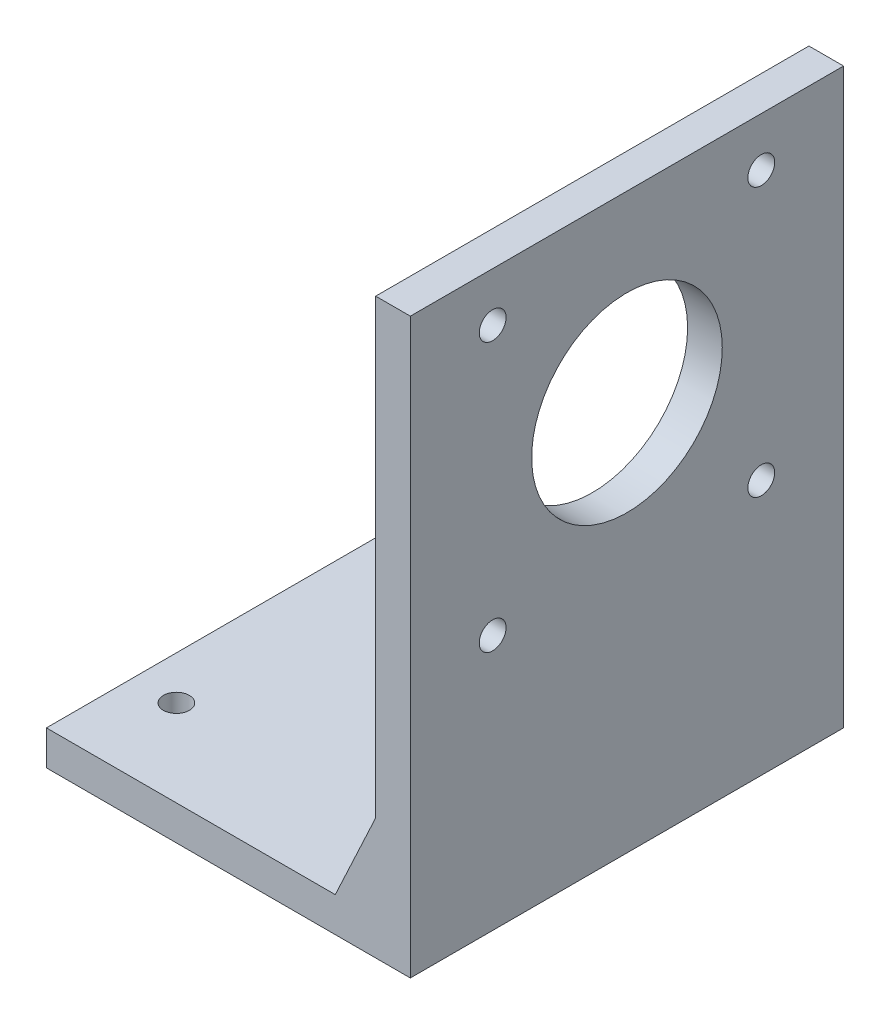
ISO-10303-21;
HEADER;
FILE_DESCRIPTION(('STEP AP214'),'2;1');
FILE_NAME('part.step','',(''),(''),'','','');
FILE_SCHEMA(('AUTOMOTIVE_DESIGN { 1 0 10303 214 1 1 1 1 }'));
ENDSEC;
DATA;
#1=APPLICATION_CONTEXT('core data for automotive mechanical design processes');
#2=APPLICATION_PROTOCOL_DEFINITION('international standard','automotive_design',2000,#1);
#3=PRODUCT_CONTEXT('',#1,'mechanical');
#4=PRODUCT('Part','Part','',(#3));
#5=PRODUCT_RELATED_PRODUCT_CATEGORY('part','',(#4));
#6=PRODUCT_DEFINITION_FORMATION('','',#4);
#7=PRODUCT_DEFINITION_CONTEXT('part definition',#1,'design');
#8=PRODUCT_DEFINITION('design','',#6,#7);
#9=PRODUCT_DEFINITION_SHAPE('','',#8);
#10=(LENGTH_UNIT() NAMED_UNIT(*) SI_UNIT(.MILLI.,.METRE.));
#11=(NAMED_UNIT(*) PLANE_ANGLE_UNIT() SI_UNIT($,.RADIAN.));
#12=(NAMED_UNIT(*) SI_UNIT($,.STERADIAN.) SOLID_ANGLE_UNIT());
#13=UNCERTAINTY_MEASURE_WITH_UNIT(LENGTH_MEASURE(1.E-05),#10,'distance_accuracy_value','');
#14=(GEOMETRIC_REPRESENTATION_CONTEXT(3) GLOBAL_UNCERTAINTY_ASSIGNED_CONTEXT((#13)) GLOBAL_UNIT_ASSIGNED_CONTEXT((#10,
#11,#12)) REPRESENTATION_CONTEXT('',''));
#15=CARTESIAN_POINT('',(0.,0.,0.));
#16=DIRECTION('',(0.,0.,1.));
#17=DIRECTION('',(1.,0.,0.));
#18=AXIS2_PLACEMENT_3D('',#15,#16,#17);
#19=CARTESIAN_POINT('',(0.,0.,0.));
#20=DIRECTION('',(1.,0.,0.));
#21=DIRECTION('',(0.,0.,-1.));
#22=AXIS2_PLACEMENT_3D('',#19,#20,#21);
#23=PLANE('',#22);
#24=CARTESIAN_POINT('',(0.,-3.57499999999999,15.5));
#25=DIRECTION('',(1.,0.,0.));
#26=DIRECTION('',(0.,0.,-1.));
#27=AXIS2_PLACEMENT_3D('',#24,#25,#26);
#28=CIRCLE('',#27,1.55);
#29=CARTESIAN_POINT('',(0.,-3.57499999999999,13.95));
#30=VERTEX_POINT('',#29);
#31=EDGE_CURVE('E133',#30,#30,#28,.T.);
#32=ORIENTED_EDGE('',*,*,#31,.T.);
#33=EDGE_LOOP('',(#32));
#34=FACE_BOUND('',#33,.T.);
#35=CARTESIAN_POINT('',(0.,-3.57499999999999,-15.5));
#36=DIRECTION('',(1.,0.,0.));
#37=DIRECTION('',(0.,0.,-1.));
#38=AXIS2_PLACEMENT_3D('',#35,#36,#37);
#39=CIRCLE('',#38,1.55);
#40=CARTESIAN_POINT('',(0.,-3.57499999999999,-17.05));
#41=VERTEX_POINT('',#40);
#42=EDGE_CURVE('E137',#41,#41,#39,.T.);
#43=ORIENTED_EDGE('',*,*,#42,.T.);
#44=EDGE_LOOP('',(#43));
#45=FACE_BOUND('',#44,.T.);
#46=CARTESIAN_POINT('',(0.,27.425,-15.5));
#47=DIRECTION('',(1.,0.,0.));
#48=DIRECTION('',(0.,0.,-1.));
#49=AXIS2_PLACEMENT_3D('',#46,#47,#48);
#50=CIRCLE('',#49,1.55);
#51=CARTESIAN_POINT('',(0.,27.425,-17.05));
#52=VERTEX_POINT('',#51);
#53=EDGE_CURVE('E143',#52,#52,#50,.T.);
#54=ORIENTED_EDGE('',*,*,#53,.T.);
#55=EDGE_LOOP('',(#54));
#56=FACE_BOUND('',#55,.T.);
#57=CARTESIAN_POINT('',(0.,27.425,15.5));
#58=DIRECTION('',(1.,0.,0.));
#59=DIRECTION('',(0.,0.,-1.));
#60=AXIS2_PLACEMENT_3D('',#57,#58,#59);
#61=CIRCLE('',#60,1.55);
#62=CARTESIAN_POINT('',(0.,27.425,13.95));
#63=VERTEX_POINT('',#62);
#64=EDGE_CURVE('E149',#63,#63,#61,.T.);
#65=ORIENTED_EDGE('',*,*,#64,.T.);
#66=EDGE_LOOP('',(#65));
#67=FACE_BOUND('',#66,.T.);
#68=CARTESIAN_POINT('',(0.,11.925,0.));
#69=DIRECTION('',(1.,0.,0.));
#70=DIRECTION('',(0.,0.,-1.));
#71=AXIS2_PLACEMENT_3D('',#68,#69,#70);
#72=CIRCLE('',#71,11.);
#73=CARTESIAN_POINT('',(0.,11.925,-11.));
#74=VERTEX_POINT('',#73);
#75=EDGE_CURVE('E155',#74,#74,#72,.T.);
#76=ORIENTED_EDGE('',*,*,#75,.T.);
#77=EDGE_LOOP('',(#76));
#78=FACE_BOUND('',#77,.T.);
#79=DIRECTION('',(0.,1.,0.));
#80=VECTOR('',#79,1.);
#81=CARTESIAN_POINT('',(0.,33.075,-25.));
#82=LINE('',#81,#80);
#83=CARTESIAN_POINT('',(0.,-19.0750000000001,-25.));
#84=VERTEX_POINT('',#83);
#85=CARTESIAN_POINT('',(0.,33.075,-25.));
#86=VERTEX_POINT('',#85);
#87=EDGE_CURVE('E161',#84,#86,#82,.T.);
#88=ORIENTED_EDGE('',*,*,#87,.F.);
#89=DIRECTION('',(0.,0.,1.));
#90=VECTOR('',#89,1.);
#91=CARTESIAN_POINT('',(0.,-19.0750000000001,25.));
#92=LINE('',#91,#90);
#93=CARTESIAN_POINT('',(0.,-19.0750000000001,25.));
#94=VERTEX_POINT('',#93);
#95=EDGE_CURVE('E57',#84,#94,#92,.T.);
#96=ORIENTED_EDGE('',*,*,#95,.T.);
#97=DIRECTION('',(0.,-1.,0.));
#98=VECTOR('',#97,1.);
#99=CARTESIAN_POINT('',(0.,33.075,25.));
#100=LINE('',#99,#98);
#101=CARTESIAN_POINT('',(0.,33.075,25.));
#102=VERTEX_POINT('',#101);
#103=EDGE_CURVE('E166',#102,#94,#100,.T.);
#104=ORIENTED_EDGE('',*,*,#103,.F.);
#105=DIRECTION('',(0.,0.,1.));
#106=VECTOR('',#105,1.);
#107=CARTESIAN_POINT('',(0.,33.075,25.));
#108=LINE('',#107,#106);
#109=EDGE_CURVE('E172',#86,#102,#108,.T.);
#110=ORIENTED_EDGE('',*,*,#109,.F.);
#111=EDGE_LOOP('',(#88,#96,#104,#110));
#112=FACE_BOUND('',#111,.T.);
#113=ADVANCED_FACE('F36',(#34,#45,#56,#67,#78,#112),#23,.F.);
#114=CARTESIAN_POINT('',(4.,0.,0.));
#115=DIRECTION('',(1.,0.,0.));
#116=DIRECTION('',(0.,0.,-1.));
#117=AXIS2_PLACEMENT_3D('',#114,#115,#116);
#118=PLANE('',#117);
#119=CARTESIAN_POINT('',(4.,-3.57499999999999,-15.5));
#120=DIRECTION('',(1.,0.,0.));
#121=DIRECTION('',(0.,0.,-1.));
#122=AXIS2_PLACEMENT_3D('',#119,#120,#121);
#123=CIRCLE('',#122,1.55);
#124=CARTESIAN_POINT('',(4.,-3.57499999999999,-17.05));
#125=VERTEX_POINT('',#124);
#126=EDGE_CURVE('E140',#125,#125,#123,.T.);
#127=ORIENTED_EDGE('',*,*,#126,.F.);
#128=EDGE_LOOP('',(#127));
#129=FACE_BOUND('',#128,.T.);
#130=CARTESIAN_POINT('',(4.,27.425,15.5));
#131=DIRECTION('',(1.,0.,0.));
#132=DIRECTION('',(0.,0.,-1.));
#133=AXIS2_PLACEMENT_3D('',#130,#131,#132);
#134=CIRCLE('',#133,1.55);
#135=CARTESIAN_POINT('',(4.,27.425,13.95));
#136=VERTEX_POINT('',#135);
#137=EDGE_CURVE('E152',#136,#136,#134,.T.);
#138=ORIENTED_EDGE('',*,*,#137,.F.);
#139=EDGE_LOOP('',(#138));
#140=FACE_BOUND('',#139,.T.);
#141=DIRECTION('',(0.,1.,0.));
#142=VECTOR('',#141,1.);
#143=CARTESIAN_POINT('',(4.,33.075,-25.));
#144=LINE('',#143,#142);
#145=CARTESIAN_POINT('',(4.,-33.075,-25.));
#146=VERTEX_POINT('',#145);
#147=CARTESIAN_POINT('',(4.,33.075,-25.));
#148=VERTEX_POINT('',#147);
#149=EDGE_CURVE('E101',#146,#148,#144,.T.);
#150=ORIENTED_EDGE('',*,*,#149,.T.);
#151=DIRECTION('',(0.,0.,1.));
#152=VECTOR('',#151,1.);
#153=CARTESIAN_POINT('',(4.,33.075,25.));
#154=LINE('',#153,#152);
#155=CARTESIAN_POINT('',(4.,33.075,25.));
#156=VERTEX_POINT('',#155);
#157=EDGE_CURVE('E165',#148,#156,#154,.T.);
#158=ORIENTED_EDGE('',*,*,#157,.T.);
#159=DIRECTION('',(0.,-1.,0.));
#160=VECTOR('',#159,1.);
#161=CARTESIAN_POINT('',(4.,33.075,25.));
#162=LINE('',#161,#160);
#163=CARTESIAN_POINT('',(4.,-33.075,25.));
#164=VERTEX_POINT('',#163);
#165=EDGE_CURVE('E168',#156,#164,#162,.T.);
#166=ORIENTED_EDGE('',*,*,#165,.T.);
#167=DIRECTION('',(0.,0.,-1.));
#168=VECTOR('',#167,1.);
#169=CARTESIAN_POINT('',(4.,-33.075,25.));
#170=LINE('',#169,#168);
#171=EDGE_CURVE('E105',#164,#146,#170,.T.);
#172=ORIENTED_EDGE('',*,*,#171,.T.);
#173=EDGE_LOOP('',(#150,#158,#166,#172));
#174=FACE_BOUND('',#173,.T.);
#175=CARTESIAN_POINT('',(4.,11.925,0.));
#176=DIRECTION('',(1.,0.,0.));
#177=DIRECTION('',(0.,0.,-1.));
#178=AXIS2_PLACEMENT_3D('',#175,#176,#177);
#179=CIRCLE('',#178,11.);
#180=CARTESIAN_POINT('',(4.,11.925,-11.));
#181=VERTEX_POINT('',#180);
#182=EDGE_CURVE('E158',#181,#181,#179,.T.);
#183=ORIENTED_EDGE('',*,*,#182,.F.);
#184=EDGE_LOOP('',(#183));
#185=FACE_BOUND('',#184,.T.);
#186=CARTESIAN_POINT('',(4.,27.425,-15.5));
#187=DIRECTION('',(1.,0.,0.));
#188=DIRECTION('',(0.,0.,-1.));
#189=AXIS2_PLACEMENT_3D('',#186,#187,#188);
#190=CIRCLE('',#189,1.55);
#191=CARTESIAN_POINT('',(4.,27.425,-17.05));
#192=VERTEX_POINT('',#191);
#193=EDGE_CURVE('E146',#192,#192,#190,.T.);
#194=ORIENTED_EDGE('',*,*,#193,.F.);
#195=EDGE_LOOP('',(#194));
#196=FACE_BOUND('',#195,.T.);
#197=CARTESIAN_POINT('',(4.,-3.57499999999999,15.5));
#198=DIRECTION('',(1.,0.,0.));
#199=DIRECTION('',(0.,0.,-1.));
#200=AXIS2_PLACEMENT_3D('',#197,#198,#199);
#201=CIRCLE('',#200,1.55);
#202=CARTESIAN_POINT('',(4.,-3.57499999999999,13.95));
#203=VERTEX_POINT('',#202);
#204=EDGE_CURVE('E134',#203,#203,#201,.T.);
#205=ORIENTED_EDGE('',*,*,#204,.F.);
#206=EDGE_LOOP('',(#205));
#207=FACE_BOUND('',#206,.T.);
#208=ADVANCED_FACE('F199',(#129,#140,#174,#185,#196,#207),#118,.T.);
#209=CARTESIAN_POINT('',(4.,33.075,-25.));
#210=DIRECTION('',(0.,0.,1.));
#211=DIRECTION('',(1.,0.,0.));
#212=AXIS2_PLACEMENT_3D('',#209,#210,#211);
#213=PLANE('',#212);
#214=DIRECTION('',(-1.,0.,0.));
#215=VECTOR('',#214,1.);
#216=CARTESIAN_POINT('',(4.,-33.075,-25.));
#217=LINE('',#216,#215);
#218=CARTESIAN_POINT('',(-38.,-33.075,-25.));
#219=VERTEX_POINT('',#218);
#220=EDGE_CURVE('E94',#146,#219,#217,.T.);
#221=ORIENTED_EDGE('',*,*,#220,.T.);
#222=DIRECTION('',(0.,-1.,0.));
#223=VECTOR('',#222,1.);
#224=CARTESIAN_POINT('',(-38.,-33.075,-25.));
#225=LINE('',#224,#223);
#226=CARTESIAN_POINT('',(-38.,-29.075,-25.));
#227=VERTEX_POINT('',#226);
#228=EDGE_CURVE('E98',#227,#219,#225,.T.);
#229=ORIENTED_EDGE('',*,*,#228,.F.);
#230=DIRECTION('',(1.,0.,0.));
#231=VECTOR('',#230,1.);
#232=CARTESIAN_POINT('',(-38.,-29.075,-25.));
#233=LINE('',#232,#231);
#234=CARTESIAN_POINT('',(-4.66307658155001,-29.075,-25.));
#235=VERTEX_POINT('',#234);
#236=EDGE_CURVE('E128',#227,#235,#233,.T.);
#237=ORIENTED_EDGE('',*,*,#236,.T.);
#238=DIRECTION('',(-0.422618261740704,-0.906307787036648,0.));
#239=VECTOR('',#238,1.);
#240=CARTESIAN_POINT('',(20.6890336349545,25.2927758088143,-25.));
#241=LINE('',#240,#239);
#242=EDGE_CURVE('E44',#235,#84,#241,.F.);
#243=ORIENTED_EDGE('',*,*,#242,.T.);
#244=ORIENTED_EDGE('',*,*,#87,.T.);
#245=DIRECTION('',(-1.,0.,0.));
#246=VECTOR('',#245,1.);
#247=CARTESIAN_POINT('',(4.,33.075,-25.));
#248=LINE('',#247,#246);
#249=EDGE_CURVE('E179',#148,#86,#248,.T.);
#250=ORIENTED_EDGE('',*,*,#249,.F.);
#251=ORIENTED_EDGE('',*,*,#149,.F.);
#252=EDGE_LOOP('',(#221,#229,#237,#243,#244,#250,#251));
#253=FACE_BOUND('',#252,.T.);
#254=ADVANCED_FACE('F96',(#253),#213,.F.);
#255=CARTESIAN_POINT('',(4.,33.075,25.));
#256=DIRECTION('',(0.,-1.,0.));
#257=DIRECTION('',(0.,0.,-1.));
#258=AXIS2_PLACEMENT_3D('',#255,#256,#257);
#259=PLANE('',#258);
#260=ORIENTED_EDGE('',*,*,#109,.T.);
#261=DIRECTION('',(-1.,0.,0.));
#262=VECTOR('',#261,1.);
#263=CARTESIAN_POINT('',(4.,33.075,25.));
#264=LINE('',#263,#262);
#265=EDGE_CURVE('E176',#156,#102,#264,.T.);
#266=ORIENTED_EDGE('',*,*,#265,.F.);
#267=ORIENTED_EDGE('',*,*,#157,.F.);
#268=ORIENTED_EDGE('',*,*,#249,.T.);
#269=EDGE_LOOP('',(#260,#266,#267,#268));
#270=FACE_BOUND('',#269,.T.);
#271=ADVANCED_FACE('F197',(#270),#259,.F.);
#272=CARTESIAN_POINT('',(4.,33.075,25.));
#273=DIRECTION('',(0.,0.,-1.));
#274=DIRECTION('',(-1.,0.,0.));
#275=AXIS2_PLACEMENT_3D('',#272,#273,#274);
#276=PLANE('',#275);
#277=ORIENTED_EDGE('',*,*,#103,.T.);
#278=DIRECTION('',(0.422618261740704,0.906307787036648,0.));
#279=VECTOR('',#278,1.);
#280=CARTESIAN_POINT('',(20.6890336349545,25.2927758088143,25.));
#281=LINE('',#280,#279);
#282=CARTESIAN_POINT('',(-4.66307658155001,-29.075,25.));
#283=VERTEX_POINT('',#282);
#284=EDGE_CURVE('E11',#94,#283,#281,.F.);
#285=ORIENTED_EDGE('',*,*,#284,.T.);
#286=DIRECTION('',(1.,0.,0.));
#287=VECTOR('',#286,1.);
#288=CARTESIAN_POINT('',(-38.,-29.075,25.));
#289=LINE('',#288,#287);
#290=CARTESIAN_POINT('',(-38.,-29.075,25.));
#291=VERTEX_POINT('',#290);
#292=EDGE_CURVE('E130',#291,#283,#289,.T.);
#293=ORIENTED_EDGE('',*,*,#292,.F.);
#294=DIRECTION('',(0.,1.,0.));
#295=VECTOR('',#294,1.);
#296=CARTESIAN_POINT('',(-38.,-33.075,25.));
#297=LINE('',#296,#295);
#298=CARTESIAN_POINT('',(-38.,-33.075,25.));
#299=VERTEX_POINT('',#298);
#300=EDGE_CURVE('E113',#299,#291,#297,.T.);
#301=ORIENTED_EDGE('',*,*,#300,.F.);
#302=DIRECTION('',(-1.,0.,0.));
#303=VECTOR('',#302,1.);
#304=CARTESIAN_POINT('',(4.,-33.075,25.));
#305=LINE('',#304,#303);
#306=EDGE_CURVE('E104',#164,#299,#305,.T.);
#307=ORIENTED_EDGE('',*,*,#306,.F.);
#308=ORIENTED_EDGE('',*,*,#165,.F.);
#309=ORIENTED_EDGE('',*,*,#265,.T.);
#310=EDGE_LOOP('',(#277,#285,#293,#301,#307,#308,#309));
#311=FACE_BOUND('',#310,.T.);
#312=ADVANCED_FACE('F192',(#311),#276,.F.);
#313=CARTESIAN_POINT('',(4.,-33.075,25.));
#314=DIRECTION('',(0.,1.,0.));
#315=DIRECTION('',(0.,0.,1.));
#316=AXIS2_PLACEMENT_3D('',#313,#314,#315);
#317=PLANE('',#316);
#318=CARTESIAN_POINT('',(-33.,-33.075,15.));
#319=DIRECTION('',(0.,1.,0.));
#320=DIRECTION('',(0.,0.,1.));
#321=AXIS2_PLACEMENT_3D('',#318,#319,#320);
#322=CIRCLE('',#321,1.5);
#323=CARTESIAN_POINT('',(-33.,-33.075,16.5));
#324=VERTEX_POINT('',#323);
#325=EDGE_CURVE('E400',#324,#324,#322,.T.);
#326=ORIENTED_EDGE('',*,*,#325,.T.);
#327=EDGE_LOOP('',(#326));
#328=FACE_BOUND('',#327,.T.);
#329=CARTESIAN_POINT('',(-8.,-33.075,-15.));
#330=DIRECTION('',(0.,1.,0.));
#331=DIRECTION('',(0.,0.,-1.));
#332=AXIS2_PLACEMENT_3D('',#329,#330,#331);
#333=CIRCLE('',#332,1.5);
#334=CARTESIAN_POINT('',(-8.,-33.075,-16.5));
#335=VERTEX_POINT('',#334);
#336=EDGE_CURVE('E404',#335,#335,#333,.T.);
#337=ORIENTED_EDGE('',*,*,#336,.T.);
#338=EDGE_LOOP('',(#337));
#339=FACE_BOUND('',#338,.T.);
#340=CARTESIAN_POINT('',(-33.,-33.075,-15.));
#341=DIRECTION('',(0.,1.,0.));
#342=DIRECTION('',(0.,0.,-1.));
#343=AXIS2_PLACEMENT_3D('',#340,#341,#342);
#344=CIRCLE('',#343,1.5);
#345=CARTESIAN_POINT('',(-33.,-33.075,-16.5));
#346=VERTEX_POINT('',#345);
#347=EDGE_CURVE('E411',#346,#346,#344,.T.);
#348=ORIENTED_EDGE('',*,*,#347,.T.);
#349=EDGE_LOOP('',(#348));
#350=FACE_BOUND('',#349,.T.);
#351=CARTESIAN_POINT('',(-8.,-33.075,15.));
#352=DIRECTION('',(0.,1.,0.));
#353=DIRECTION('',(0.,0.,1.));
#354=AXIS2_PLACEMENT_3D('',#351,#352,#353);
#355=CIRCLE('',#354,1.5);
#356=CARTESIAN_POINT('',(-8.,-33.075,16.5));
#357=VERTEX_POINT('',#356);
#358=EDGE_CURVE('E119',#357,#357,#355,.T.);
#359=ORIENTED_EDGE('',*,*,#358,.T.);
#360=EDGE_LOOP('',(#359));
#361=FACE_BOUND('',#360,.T.);
#362=ORIENTED_EDGE('',*,*,#306,.T.);
#363=DIRECTION('',(0.,0.,1.));
#364=VECTOR('',#363,1.);
#365=CARTESIAN_POINT('',(-38.,-33.075,-25.));
#366=LINE('',#365,#364);
#367=EDGE_CURVE('E108',#219,#299,#366,.T.);
#368=ORIENTED_EDGE('',*,*,#367,.F.);
#369=ORIENTED_EDGE('',*,*,#220,.F.);
#370=ORIENTED_EDGE('',*,*,#171,.F.);
#371=EDGE_LOOP('',(#362,#368,#369,#370));
#372=FACE_BOUND('',#371,.T.);
#373=ADVANCED_FACE('F109',(#328,#339,#350,#361,#372),#317,.F.);
#374=CARTESIAN_POINT('',(4.,11.925,0.));
#375=DIRECTION('',(-1.,0.,0.));
#376=DIRECTION('',(0.,0.,1.));
#377=AXIS2_PLACEMENT_3D('',#374,#375,#376);
#378=CYLINDRICAL_SURFACE('',#377,11.);
#379=ORIENTED_EDGE('',*,*,#182,.T.);
#380=EDGE_LOOP('',(#379));
#381=FACE_BOUND('',#380,.T.);
#382=ORIENTED_EDGE('',*,*,#75,.F.);
#383=EDGE_LOOP('',(#382));
#384=FACE_BOUND('',#383,.T.);
#385=ADVANCED_FACE('F228',(#381,#384),#378,.F.);
#386=CARTESIAN_POINT('',(4.,27.425,15.5));
#387=DIRECTION('',(-1.,0.,0.));
#388=DIRECTION('',(0.,0.,1.));
#389=AXIS2_PLACEMENT_3D('',#386,#387,#388);
#390=CYLINDRICAL_SURFACE('',#389,1.55);
#391=ORIENTED_EDGE('',*,*,#137,.T.);
#392=EDGE_LOOP('',(#391));
#393=FACE_BOUND('',#392,.T.);
#394=ORIENTED_EDGE('',*,*,#64,.F.);
#395=EDGE_LOOP('',(#394));
#396=FACE_BOUND('',#395,.T.);
#397=ADVANCED_FACE('F230',(#393,#396),#390,.F.);
#398=CARTESIAN_POINT('',(4.,27.425,-15.5));
#399=DIRECTION('',(-1.,0.,0.));
#400=DIRECTION('',(0.,0.,1.));
#401=AXIS2_PLACEMENT_3D('',#398,#399,#400);
#402=CYLINDRICAL_SURFACE('',#401,1.55);
#403=ORIENTED_EDGE('',*,*,#193,.T.);
#404=EDGE_LOOP('',(#403));
#405=FACE_BOUND('',#404,.T.);
#406=ORIENTED_EDGE('',*,*,#53,.F.);
#407=EDGE_LOOP('',(#406));
#408=FACE_BOUND('',#407,.T.);
#409=ADVANCED_FACE('F237',(#405,#408),#402,.F.);
#410=CARTESIAN_POINT('',(4.,-3.57499999999999,-15.5));
#411=DIRECTION('',(-1.,0.,0.));
#412=DIRECTION('',(0.,0.,1.));
#413=AXIS2_PLACEMENT_3D('',#410,#411,#412);
#414=CYLINDRICAL_SURFACE('',#413,1.55);
#415=ORIENTED_EDGE('',*,*,#126,.T.);
#416=EDGE_LOOP('',(#415));
#417=FACE_BOUND('',#416,.T.);
#418=ORIENTED_EDGE('',*,*,#42,.F.);
#419=EDGE_LOOP('',(#418));
#420=FACE_BOUND('',#419,.T.);
#421=ADVANCED_FACE('F213',(#417,#420),#414,.F.);
#422=CARTESIAN_POINT('',(4.,-3.57499999999999,15.5));
#423=DIRECTION('',(-1.,0.,0.));
#424=DIRECTION('',(0.,0.,1.));
#425=AXIS2_PLACEMENT_3D('',#422,#423,#424);
#426=CYLINDRICAL_SURFACE('',#425,1.55);
#427=ORIENTED_EDGE('',*,*,#204,.T.);
#428=EDGE_LOOP('',(#427));
#429=FACE_BOUND('',#428,.T.);
#430=ORIENTED_EDGE('',*,*,#31,.F.);
#431=EDGE_LOOP('',(#430));
#432=FACE_BOUND('',#431,.T.);
#433=ADVANCED_FACE('F210',(#429,#432),#426,.F.);
#434=CARTESIAN_POINT('',(-38.,-29.075,-25.));
#435=DIRECTION('',(0.,-1.,0.));
#436=DIRECTION('',(0.,0.,-1.));
#437=AXIS2_PLACEMENT_3D('',#434,#435,#436);
#438=PLANE('',#437);
#439=CARTESIAN_POINT('',(-33.,-29.075,15.));
#440=DIRECTION('',(0.,1.,0.));
#441=DIRECTION('',(0.,0.,1.));
#442=AXIS2_PLACEMENT_3D('',#439,#440,#441);
#443=CIRCLE('',#442,1.5);
#444=CARTESIAN_POINT('',(-33.,-29.075,16.5));
#445=VERTEX_POINT('',#444);
#446=EDGE_CURVE('E388',#445,#445,#443,.T.);
#447=ORIENTED_EDGE('',*,*,#446,.F.);
#448=EDGE_LOOP('',(#447));
#449=FACE_BOUND('',#448,.T.);
#450=CARTESIAN_POINT('',(-8.,-29.075,-15.));
#451=DIRECTION('',(0.,1.,0.));
#452=DIRECTION('',(0.,0.,-1.));
#453=AXIS2_PLACEMENT_3D('',#450,#451,#452);
#454=CIRCLE('',#453,1.5);
#455=CARTESIAN_POINT('',(-8.,-29.075,-16.5));
#456=VERTEX_POINT('',#455);
#457=EDGE_CURVE('E392',#456,#456,#454,.T.);
#458=ORIENTED_EDGE('',*,*,#457,.F.);
#459=EDGE_LOOP('',(#458));
#460=FACE_BOUND('',#459,.T.);
#461=CARTESIAN_POINT('',(-33.,-29.075,-15.));
#462=DIRECTION('',(0.,1.,0.));
#463=DIRECTION('',(0.,0.,-1.));
#464=AXIS2_PLACEMENT_3D('',#461,#462,#463);
#465=CIRCLE('',#464,1.5);
#466=CARTESIAN_POINT('',(-33.,-29.075,-16.5));
#467=VERTEX_POINT('',#466);
#468=EDGE_CURVE('E396',#467,#467,#465,.T.);
#469=ORIENTED_EDGE('',*,*,#468,.F.);
#470=EDGE_LOOP('',(#469));
#471=FACE_BOUND('',#470,.T.);
#472=CARTESIAN_POINT('',(-8.,-29.075,15.));
#473=DIRECTION('',(0.,1.,0.));
#474=DIRECTION('',(0.,0.,1.));
#475=AXIS2_PLACEMENT_3D('',#472,#473,#474);
#476=CIRCLE('',#475,1.5);
#477=CARTESIAN_POINT('',(-8.,-29.075,16.5));
#478=VERTEX_POINT('',#477);
#479=EDGE_CURVE('E122',#478,#478,#476,.T.);
#480=ORIENTED_EDGE('',*,*,#479,.F.);
#481=EDGE_LOOP('',(#480));
#482=FACE_BOUND('',#481,.T.);
#483=ORIENTED_EDGE('',*,*,#292,.T.);
#484=DIRECTION('',(0.,0.,-1.));
#485=VECTOR('',#484,1.);
#486=CARTESIAN_POINT('',(-4.66307658155001,-29.075,-25.));
#487=LINE('',#486,#485);
#488=EDGE_CURVE('E182',#283,#235,#487,.T.);
#489=ORIENTED_EDGE('',*,*,#488,.T.);
#490=ORIENTED_EDGE('',*,*,#236,.F.);
#491=DIRECTION('',(0.,0.,-1.));
#492=VECTOR('',#491,1.);
#493=CARTESIAN_POINT('',(-38.,-29.075,-25.));
#494=LINE('',#493,#492);
#495=EDGE_CURVE('E117',#291,#227,#494,.T.);
#496=ORIENTED_EDGE('',*,*,#495,.F.);
#497=EDGE_LOOP('',(#483,#489,#490,#496));
#498=FACE_BOUND('',#497,.T.);
#499=ADVANCED_FACE('F187',(#449,#460,#471,#482,#498),#438,.F.);
#500=CARTESIAN_POINT('',(-38.,0.,0.));
#501=DIRECTION('',(1.,0.,0.));
#502=DIRECTION('',(0.,0.,-1.));
#503=AXIS2_PLACEMENT_3D('',#500,#501,#502);
#504=PLANE('',#503);
#505=ORIENTED_EDGE('',*,*,#228,.T.);
#506=ORIENTED_EDGE('',*,*,#367,.T.);
#507=ORIENTED_EDGE('',*,*,#300,.T.);
#508=ORIENTED_EDGE('',*,*,#495,.T.);
#509=EDGE_LOOP('',(#505,#506,#507,#508));
#510=FACE_BOUND('',#509,.T.);
#511=ADVANCED_FACE('F115',(#510),#504,.F.);
#512=CARTESIAN_POINT('',(-8.,-33.075,15.));
#513=DIRECTION('',(0.,1.,0.));
#514=DIRECTION('',(0.,0.,1.));
#515=AXIS2_PLACEMENT_3D('',#512,#513,#514);
#516=CYLINDRICAL_SURFACE('',#515,1.5);
#517=ORIENTED_EDGE('',*,*,#358,.F.);
#518=EDGE_LOOP('',(#517));
#519=FACE_BOUND('',#518,.T.);
#520=ORIENTED_EDGE('',*,*,#479,.T.);
#521=EDGE_LOOP('',(#520));
#522=FACE_BOUND('',#521,.T.);
#523=ADVANCED_FACE('F278',(#519,#522),#516,.F.);
#524=CARTESIAN_POINT('',(-33.,-33.075,-15.));
#525=DIRECTION('',(0.,1.,0.));
#526=DIRECTION('',(0.,0.,1.));
#527=AXIS2_PLACEMENT_3D('',#524,#525,#526);
#528=CYLINDRICAL_SURFACE('',#527,1.5);
#529=ORIENTED_EDGE('',*,*,#347,.F.);
#530=EDGE_LOOP('',(#529));
#531=FACE_BOUND('',#530,.T.);
#532=ORIENTED_EDGE('',*,*,#468,.T.);
#533=EDGE_LOOP('',(#532));
#534=FACE_BOUND('',#533,.T.);
#535=ADVANCED_FACE('F283',(#531,#534),#528,.F.);
#536=CARTESIAN_POINT('',(-8.,-33.075,-15.));
#537=DIRECTION('',(0.,1.,0.));
#538=DIRECTION('',(0.,0.,1.));
#539=AXIS2_PLACEMENT_3D('',#536,#537,#538);
#540=CYLINDRICAL_SURFACE('',#539,1.5);
#541=ORIENTED_EDGE('',*,*,#336,.F.);
#542=EDGE_LOOP('',(#541));
#543=FACE_BOUND('',#542,.T.);
#544=ORIENTED_EDGE('',*,*,#457,.T.);
#545=EDGE_LOOP('',(#544));
#546=FACE_BOUND('',#545,.T.);
#547=ADVANCED_FACE('F293',(#543,#546),#540,.F.);
#548=CARTESIAN_POINT('',(-33.,-33.075,15.));
#549=DIRECTION('',(0.,1.,0.));
#550=DIRECTION('',(0.,0.,1.));
#551=AXIS2_PLACEMENT_3D('',#548,#549,#550);
#552=CYLINDRICAL_SURFACE('',#551,1.5);
#553=ORIENTED_EDGE('',*,*,#325,.F.);
#554=EDGE_LOOP('',(#553));
#555=FACE_BOUND('',#554,.T.);
#556=ORIENTED_EDGE('',*,*,#446,.T.);
#557=EDGE_LOOP('',(#556));
#558=FACE_BOUND('',#557,.T.);
#559=ADVANCED_FACE('F303',(#555,#558),#552,.F.);
#560=CARTESIAN_POINT('',(-4.66307658155001,-29.075,-25.));
#561=DIRECTION('',(-0.906307787036648,0.422618261740703,0.));
#562=DIRECTION('',(0.,0.,1.));
#563=AXIS2_PLACEMENT_3D('',#560,#561,#562);
#564=PLANE('',#563);
#565=ORIENTED_EDGE('',*,*,#284,.F.);
#566=ORIENTED_EDGE('',*,*,#95,.F.);
#567=ORIENTED_EDGE('',*,*,#242,.F.);
#568=ORIENTED_EDGE('',*,*,#488,.F.);
#569=EDGE_LOOP('',(#565,#566,#567,#568));
#570=FACE_BOUND('',#569,.T.);
#571=ADVANCED_FACE('F38',(#570),#564,.T.);
#572=CLOSED_SHELL('',(#113,#208,#254,#271,#312,#373,#385,#397,#409,#421,#433,#499,#511,#523,
#535,#547,#559,#571));
#573=MANIFOLD_SOLID_BREP('B2',#572);
#574=ADVANCED_BREP_SHAPE_REPRESENTATION('',(#18,#573),#14);
#575=SHAPE_DEFINITION_REPRESENTATION(#9,#574);
ENDSEC;
END-ISO-10303-21;
